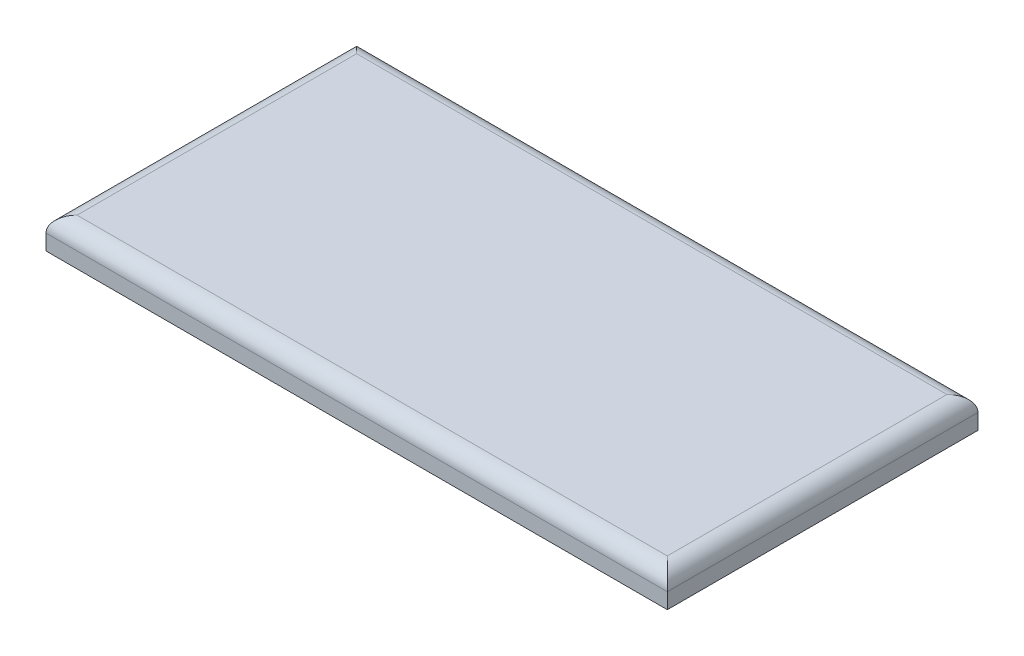
ISO-10303-21;
HEADER;
FILE_DESCRIPTION(('STEP AP214'),'2;1');
FILE_NAME('part.step','',(''),(''),'','','');
FILE_SCHEMA(('AUTOMOTIVE_DESIGN { 1 0 10303 214 1 1 1 1 }'));
ENDSEC;
DATA;
#1=APPLICATION_CONTEXT('core data for automotive mechanical design processes');
#2=APPLICATION_PROTOCOL_DEFINITION('international standard','automotive_design',2000,#1);
#3=PRODUCT_CONTEXT('',#1,'mechanical');
#4=PRODUCT('Part','Part','',(#3));
#5=PRODUCT_RELATED_PRODUCT_CATEGORY('part','',(#4));
#6=PRODUCT_DEFINITION_FORMATION('','',#4);
#7=PRODUCT_DEFINITION_CONTEXT('part definition',#1,'design');
#8=PRODUCT_DEFINITION('design','',#6,#7);
#9=PRODUCT_DEFINITION_SHAPE('','',#8);
#10=(LENGTH_UNIT() NAMED_UNIT(*) SI_UNIT(.MILLI.,.METRE.));
#11=(NAMED_UNIT(*) PLANE_ANGLE_UNIT() SI_UNIT($,.RADIAN.));
#12=(NAMED_UNIT(*) SI_UNIT($,.STERADIAN.) SOLID_ANGLE_UNIT());
#13=UNCERTAINTY_MEASURE_WITH_UNIT(LENGTH_MEASURE(1.E-05),#10,'distance_accuracy_value','');
#14=(GEOMETRIC_REPRESENTATION_CONTEXT(3) GLOBAL_UNCERTAINTY_ASSIGNED_CONTEXT((#13)) GLOBAL_UNIT_ASSIGNED_CONTEXT((#10,
#11,#12)) REPRESENTATION_CONTEXT('',''));
#15=CARTESIAN_POINT('',(0.,0.,0.));
#16=DIRECTION('',(0.,0.,1.));
#17=DIRECTION('',(1.,0.,0.));
#18=AXIS2_PLACEMENT_3D('',#15,#16,#17);
#19=CARTESIAN_POINT('',(-64.6448563866559,7.62,-17.1437540151539));
#20=DIRECTION('',(1.,0.,0.));
#21=DIRECTION('',(0.,0.,-1.));
#22=AXIS2_PLACEMENT_3D('',#19,#20,#21);
#23=PLANE('',#22);
#24=DIRECTION('',(0.,-1.,0.));
#25=VECTOR('',#24,1.);
#26=CARTESIAN_POINT('',(-64.6448563866559,7.62,59.0562459848461));
#27=LINE('',#26,#25);
#28=CARTESIAN_POINT('',(-64.6448563866559,3.81,59.0562459848461));
#29=VERTEX_POINT('',#28);
#30=CARTESIAN_POINT('',(-64.6448563866559,0.,59.0562459848461));
#31=VERTEX_POINT('',#30);
#32=EDGE_CURVE('E83',#29,#31,#27,.T.);
#33=ORIENTED_EDGE('',*,*,#32,.F.);
#34=DIRECTION('',(0.,0.,1.));
#35=VECTOR('',#34,1.);
#36=CARTESIAN_POINT('',(-64.6448563866559,3.81,-17.1437540151539));
#37=LINE('',#36,#35);
#38=CARTESIAN_POINT('',(-64.6448563866559,3.81,-17.1437540151539));
#39=VERTEX_POINT('',#38);
#40=EDGE_CURVE('E11',#29,#39,#37,.F.);
#41=ORIENTED_EDGE('',*,*,#40,.T.);
#42=DIRECTION('',(0.,-1.,0.));
#43=VECTOR('',#42,1.);
#44=CARTESIAN_POINT('',(-64.6448563866559,7.62,-17.1437540151539));
#45=LINE('',#44,#43);
#46=CARTESIAN_POINT('',(-64.6448563866559,0.,-17.1437540151539));
#47=VERTEX_POINT('',#46);
#48=EDGE_CURVE('E100',#39,#47,#45,.T.);
#49=ORIENTED_EDGE('',*,*,#48,.T.);
#50=DIRECTION('',(0.,0.,1.));
#51=VECTOR('',#50,1.);
#52=CARTESIAN_POINT('',(-64.6448563866559,0.,-17.1437540151539));
#53=LINE('',#52,#51);
#54=EDGE_CURVE('E96',#47,#31,#53,.T.);
#55=ORIENTED_EDGE('',*,*,#54,.T.);
#56=EDGE_LOOP('',(#33,#41,#49,#55));
#57=FACE_BOUND('',#56,.T.);
#58=ADVANCED_FACE('F32',(#57),#23,.F.);
#59=CARTESIAN_POINT('',(-64.6448563866559,7.62,59.0562459848461));
#60=DIRECTION('',(0.,0.,-1.));
#61=DIRECTION('',(-1.,0.,0.));
#62=AXIS2_PLACEMENT_3D('',#59,#60,#61);
#63=PLANE('',#62);
#64=DIRECTION('',(0.,-1.,0.));
#65=VECTOR('',#64,1.);
#66=CARTESIAN_POINT('',(87.7551436133441,7.62,59.0562459848461));
#67=LINE('',#66,#65);
#68=CARTESIAN_POINT('',(87.7551436133441,3.81,59.0562459848461));
#69=VERTEX_POINT('',#68);
#70=CARTESIAN_POINT('',(87.7551436133441,0.,59.0562459848461));
#71=VERTEX_POINT('',#70);
#72=EDGE_CURVE('E90',#69,#71,#67,.T.);
#73=ORIENTED_EDGE('',*,*,#72,.F.);
#74=DIRECTION('',(1.,0.,0.));
#75=VECTOR('',#74,1.);
#76=CARTESIAN_POINT('',(-64.6448563866559,3.81,59.0562459848461));
#77=LINE('',#76,#75);
#78=EDGE_CURVE('E41',#69,#29,#77,.F.);
#79=ORIENTED_EDGE('',*,*,#78,.T.);
#80=ORIENTED_EDGE('',*,*,#32,.T.);
#81=DIRECTION('',(1.,0.,0.));
#82=VECTOR('',#81,1.);
#83=CARTESIAN_POINT('',(-64.6448563866559,0.,59.0562459848461));
#84=LINE('',#83,#82);
#85=EDGE_CURVE('E86',#31,#71,#84,.T.);
#86=ORIENTED_EDGE('',*,*,#85,.T.);
#87=EDGE_LOOP('',(#73,#79,#80,#86));
#88=FACE_BOUND('',#87,.T.);
#89=ADVANCED_FACE('F85',(#88),#63,.F.);
#90=CARTESIAN_POINT('',(87.7551436133441,7.62,-17.1437540151539));
#91=DIRECTION('',(-1.,0.,0.));
#92=DIRECTION('',(0.,0.,1.));
#93=AXIS2_PLACEMENT_3D('',#90,#91,#92);
#94=PLANE('',#93);
#95=DIRECTION('',(0.,-1.,0.));
#96=VECTOR('',#95,1.);
#97=CARTESIAN_POINT('',(87.7551436133441,7.62,-17.1437540151539));
#98=LINE('',#97,#96);
#99=CARTESIAN_POINT('',(87.7551436133441,3.81,-17.1437540151539));
#100=VERTEX_POINT('',#99);
#101=CARTESIAN_POINT('',(87.7551436133441,0.,-17.1437540151539));
#102=VERTEX_POINT('',#101);
#103=EDGE_CURVE('E110',#100,#102,#98,.T.);
#104=ORIENTED_EDGE('',*,*,#103,.F.);
#105=DIRECTION('',(0.,0.,-1.));
#106=VECTOR('',#105,1.);
#107=CARTESIAN_POINT('',(87.7551436133441,3.81,59.0562459848461));
#108=LINE('',#107,#106);
#109=EDGE_CURVE('E121',#100,#69,#108,.F.);
#110=ORIENTED_EDGE('',*,*,#109,.T.);
#111=ORIENTED_EDGE('',*,*,#72,.T.);
#112=DIRECTION('',(0.,0.,-1.));
#113=VECTOR('',#112,1.);
#114=CARTESIAN_POINT('',(87.7551436133441,0.,-17.1437540151539));
#115=LINE('',#114,#113);
#116=EDGE_CURVE('E98',#71,#102,#115,.T.);
#117=ORIENTED_EDGE('',*,*,#116,.T.);
#118=EDGE_LOOP('',(#104,#110,#111,#117));
#119=FACE_BOUND('',#118,.T.);
#120=ADVANCED_FACE('F150',(#119),#94,.F.);
#121=CARTESIAN_POINT('',(-64.6448563866559,7.62,-17.1437540151539));
#122=DIRECTION('',(0.,0.,1.));
#123=DIRECTION('',(1.,0.,0.));
#124=AXIS2_PLACEMENT_3D('',#121,#122,#123);
#125=PLANE('',#124);
#126=ORIENTED_EDGE('',*,*,#48,.F.);
#127=DIRECTION('',(-1.,0.,0.));
#128=VECTOR('',#127,1.);
#129=CARTESIAN_POINT('',(87.7551436133441,3.81,-17.1437540151539));
#130=LINE('',#129,#128);
#131=EDGE_CURVE('E124',#39,#100,#130,.F.);
#132=ORIENTED_EDGE('',*,*,#131,.T.);
#133=ORIENTED_EDGE('',*,*,#103,.T.);
#134=DIRECTION('',(-1.,0.,0.));
#135=VECTOR('',#134,1.);
#136=CARTESIAN_POINT('',(-64.6448563866559,0.,-17.1437540151539));
#137=LINE('',#136,#135);
#138=EDGE_CURVE('E107',#102,#47,#137,.T.);
#139=ORIENTED_EDGE('',*,*,#138,.T.);
#140=EDGE_LOOP('',(#126,#132,#133,#139));
#141=FACE_BOUND('',#140,.T.);
#142=ADVANCED_FACE('F152',(#141),#125,.F.);
#143=CARTESIAN_POINT('',(0.,7.62,0.));
#144=DIRECTION('',(0.,1.,0.));
#145=DIRECTION('',(0.,0.,1.));
#146=AXIS2_PLACEMENT_3D('',#143,#144,#145);
#147=PLANE('',#146);
#148=DIRECTION('',(1.,0.,0.));
#149=VECTOR('',#148,1.);
#150=CARTESIAN_POINT('',(87.7551436133441,7.62,55.2462459848461));
#151=LINE('',#150,#149);
#152=CARTESIAN_POINT('',(-60.8348563866559,7.62,55.2462459848461));
#153=VERTEX_POINT('',#152);
#154=CARTESIAN_POINT('',(83.9451436133441,7.62,55.2462459848461));
#155=VERTEX_POINT('',#154);
#156=EDGE_CURVE('E114',#153,#155,#151,.T.);
#157=ORIENTED_EDGE('',*,*,#156,.T.);
#158=DIRECTION('',(0.,0.,-1.));
#159=VECTOR('',#158,1.);
#160=CARTESIAN_POINT('',(83.9451436133441,7.62,-17.1437540151539));
#161=LINE('',#160,#159);
#162=CARTESIAN_POINT('',(83.9451436133441,7.62,-13.3337540151539));
#163=VERTEX_POINT('',#162);
#164=EDGE_CURVE('E118',#155,#163,#161,.T.);
#165=ORIENTED_EDGE('',*,*,#164,.T.);
#166=DIRECTION('',(-1.,0.,0.));
#167=VECTOR('',#166,1.);
#168=CARTESIAN_POINT('',(-64.6448563866559,7.62,-13.3337540151539));
#169=LINE('',#168,#167);
#170=CARTESIAN_POINT('',(-60.8348563866559,7.62,-13.3337540151539));
#171=VERTEX_POINT('',#170);
#172=EDGE_CURVE('E116',#163,#171,#169,.T.);
#173=ORIENTED_EDGE('',*,*,#172,.T.);
#174=DIRECTION('',(0.,0.,1.));
#175=VECTOR('',#174,1.);
#176=CARTESIAN_POINT('',(-60.8348563866559,7.62,59.0562459848461));
#177=LINE('',#176,#175);
#178=EDGE_CURVE('E89',#171,#153,#177,.T.);
#179=ORIENTED_EDGE('',*,*,#178,.T.);
#180=EDGE_LOOP('',(#157,#165,#173,#179));
#181=FACE_BOUND('',#180,.T.);
#182=ADVANCED_FACE('F142',(#181),#147,.T.);
#183=CARTESIAN_POINT('',(0.,0.,0.));
#184=DIRECTION('',(0.,1.,0.));
#185=DIRECTION('',(0.,0.,1.));
#186=AXIS2_PLACEMENT_3D('',#183,#184,#185);
#187=PLANE('',#186);
#188=ORIENTED_EDGE('',*,*,#54,.F.);
#189=ORIENTED_EDGE('',*,*,#138,.F.);
#190=ORIENTED_EDGE('',*,*,#116,.F.);
#191=ORIENTED_EDGE('',*,*,#85,.F.);
#192=EDGE_LOOP('',(#188,#189,#190,#191));
#193=FACE_BOUND('',#192,.T.);
#194=ADVANCED_FACE('F94',(#193),#187,.F.);
#195=CARTESIAN_POINT('',(-60.8348563866559,3.81,0.));
#196=DIRECTION('',(0.,0.,-1.));
#197=DIRECTION('',(-1.,0.,0.));
#198=AXIS2_PLACEMENT_3D('',#195,#196,#197);
#199=CYLINDRICAL_SURFACE('',#198,3.81);
#200=CARTESIAN_POINT('',(-60.8348563866559,3.81,-13.3337540151539));
#201=DIRECTION('',(0.707106781186547,0.,-0.707106781186548));
#202=DIRECTION('',(-0.707106781186548,0.,-0.707106781186547));
#203=AXIS2_PLACEMENT_3D('',#200,#201,#202);
#204=ELLIPSE('',#203,5.38815367264149,3.81);
#205=EDGE_CURVE('E104',#39,#171,#204,.T.);
#206=ORIENTED_EDGE('',*,*,#205,.F.);
#207=ORIENTED_EDGE('',*,*,#40,.F.);
#208=CARTESIAN_POINT('',(-60.8348563866559,3.81,55.2462459848461));
#209=DIRECTION('',(-0.707106781186548,0.,-0.707106781186547));
#210=DIRECTION('',(0.707106781186547,0.,-0.707106781186548));
#211=AXIS2_PLACEMENT_3D('',#208,#209,#210);
#212=ELLIPSE('',#211,5.38815367264149,3.81);
#213=EDGE_CURVE('E36',#153,#29,#212,.F.);
#214=ORIENTED_EDGE('',*,*,#213,.F.);
#215=ORIENTED_EDGE('',*,*,#178,.F.);
#216=EDGE_LOOP('',(#206,#207,#214,#215));
#217=FACE_BOUND('',#216,.T.);
#218=ADVANCED_FACE('F34',(#217),#199,.T.);
#219=CARTESIAN_POINT('',(0.,3.81,55.2462459848461));
#220=DIRECTION('',(-1.,0.,0.));
#221=DIRECTION('',(0.,0.,1.));
#222=AXIS2_PLACEMENT_3D('',#219,#220,#221);
#223=CYLINDRICAL_SURFACE('',#222,3.81);
#224=ORIENTED_EDGE('',*,*,#213,.T.);
#225=ORIENTED_EDGE('',*,*,#78,.F.);
#226=CARTESIAN_POINT('',(83.9451436133441,3.81,55.2462459848461));
#227=DIRECTION('',(-0.707106781186547,0.,0.707106781186548));
#228=DIRECTION('',(-0.707106781186548,0.,-0.707106781186547));
#229=AXIS2_PLACEMENT_3D('',#226,#227,#228);
#230=ELLIPSE('',#229,5.38815367264149,3.81);
#231=EDGE_CURVE('E129',#155,#69,#230,.F.);
#232=ORIENTED_EDGE('',*,*,#231,.F.);
#233=ORIENTED_EDGE('',*,*,#156,.F.);
#234=EDGE_LOOP('',(#224,#225,#232,#233));
#235=FACE_BOUND('',#234,.T.);
#236=ADVANCED_FACE('F172',(#235),#223,.T.);
#237=CARTESIAN_POINT('',(0.,3.81,-13.3337540151539));
#238=DIRECTION('',(1.,0.,0.));
#239=DIRECTION('',(0.,0.,-1.));
#240=AXIS2_PLACEMENT_3D('',#237,#238,#239);
#241=CYLINDRICAL_SURFACE('',#240,3.81);
#242=ORIENTED_EDGE('',*,*,#205,.T.);
#243=ORIENTED_EDGE('',*,*,#172,.F.);
#244=CARTESIAN_POINT('',(83.9451436133441,3.81,-13.3337540151539));
#245=DIRECTION('',(0.707106781186548,0.,0.707106781186547));
#246=DIRECTION('',(0.707106781186547,0.,-0.707106781186548));
#247=AXIS2_PLACEMENT_3D('',#244,#245,#246);
#248=ELLIPSE('',#247,5.38815367264149,3.81);
#249=EDGE_CURVE('E127',#100,#163,#248,.T.);
#250=ORIENTED_EDGE('',*,*,#249,.F.);
#251=ORIENTED_EDGE('',*,*,#131,.F.);
#252=EDGE_LOOP('',(#242,#243,#250,#251));
#253=FACE_BOUND('',#252,.T.);
#254=ADVANCED_FACE('F135',(#253),#241,.T.);
#255=CARTESIAN_POINT('',(83.9451436133441,3.81,0.));
#256=DIRECTION('',(0.,0.,1.));
#257=DIRECTION('',(1.,0.,0.));
#258=AXIS2_PLACEMENT_3D('',#255,#256,#257);
#259=CYLINDRICAL_SURFACE('',#258,3.81);
#260=ORIENTED_EDGE('',*,*,#231,.T.);
#261=ORIENTED_EDGE('',*,*,#109,.F.);
#262=ORIENTED_EDGE('',*,*,#249,.T.);
#263=ORIENTED_EDGE('',*,*,#164,.F.);
#264=EDGE_LOOP('',(#260,#261,#262,#263));
#265=FACE_BOUND('',#264,.T.);
#266=ADVANCED_FACE('F146',(#265),#259,.T.);
#267=CLOSED_SHELL('',(#58,#89,#120,#142,#182,#194,#218,#236,#254,#266));
#268=MANIFOLD_SOLID_BREP('B2',#267);
#269=ADVANCED_BREP_SHAPE_REPRESENTATION('',(#18,#268),#14);
#270=SHAPE_DEFINITION_REPRESENTATION(#9,#269);
ENDSEC;
END-ISO-10303-21;
